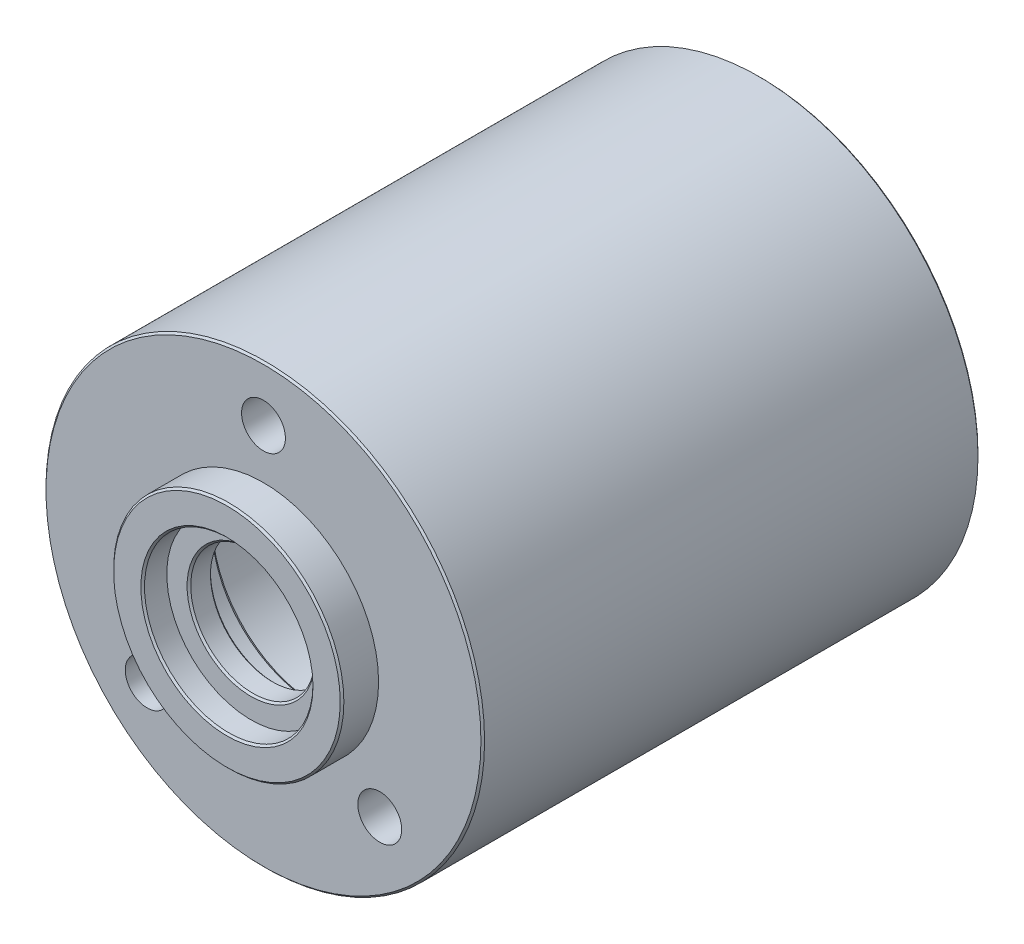
ISO-10303-21;
HEADER;
FILE_DESCRIPTION(('STEP AP214'),'2;1');
FILE_NAME('part.step','',(''),(''),'','','');
FILE_SCHEMA(('AUTOMOTIVE_DESIGN { 1 0 10303 214 1 1 1 1 }'));
ENDSEC;
DATA;
#1=APPLICATION_CONTEXT('core data for automotive mechanical design processes');
#2=APPLICATION_PROTOCOL_DEFINITION('international standard','automotive_design',2000,#1);
#3=PRODUCT_CONTEXT('',#1,'mechanical');
#4=PRODUCT('Part','Part','',(#3));
#5=PRODUCT_RELATED_PRODUCT_CATEGORY('part','',(#4));
#6=PRODUCT_DEFINITION_FORMATION('','',#4);
#7=PRODUCT_DEFINITION_CONTEXT('part definition',#1,'design');
#8=PRODUCT_DEFINITION('design','',#6,#7);
#9=PRODUCT_DEFINITION_SHAPE('','',#8);
#10=(LENGTH_UNIT() NAMED_UNIT(*) SI_UNIT(.MILLI.,.METRE.));
#11=(NAMED_UNIT(*) PLANE_ANGLE_UNIT() SI_UNIT($,.RADIAN.));
#12=(NAMED_UNIT(*) SI_UNIT($,.STERADIAN.) SOLID_ANGLE_UNIT());
#13=UNCERTAINTY_MEASURE_WITH_UNIT(LENGTH_MEASURE(1.E-05),#10,'distance_accuracy_value','');
#14=(GEOMETRIC_REPRESENTATION_CONTEXT(3) GLOBAL_UNCERTAINTY_ASSIGNED_CONTEXT((#13)) GLOBAL_UNIT_ASSIGNED_CONTEXT((#10,
#11,#12)) REPRESENTATION_CONTEXT('',''));
#15=CARTESIAN_POINT('',(0.,0.,0.));
#16=DIRECTION('',(0.,0.,1.));
#17=DIRECTION('',(1.,0.,0.));
#18=AXIS2_PLACEMENT_3D('',#15,#16,#17);
#19=CARTESIAN_POINT('',(0.,0.,0.));
#20=DIRECTION('',(0.,0.,1.));
#21=DIRECTION('',(1.,0.,0.));
#22=AXIS2_PLACEMENT_3D('',#19,#20,#21);
#23=CYLINDRICAL_SURFACE('',#22,26.85);
#24=CARTESIAN_POINT('',(0.,0.,-72.));
#25=DIRECTION('',(0.,0.,1.));
#26=DIRECTION('',(1.,0.,0.));
#27=AXIS2_PLACEMENT_3D('',#24,#25,#26);
#28=CIRCLE('',#27,26.85);
#29=CARTESIAN_POINT('',(26.85,0.,-72.));
#30=VERTEX_POINT('',#29);
#31=EDGE_CURVE('E114',#30,#30,#28,.T.);
#32=ORIENTED_EDGE('',*,*,#31,.F.);
#33=EDGE_LOOP('',(#32));
#34=FACE_BOUND('',#33,.T.);
#35=CARTESIAN_POINT('',(0.,0.,-73.));
#36=DIRECTION('',(0.,0.,1.));
#37=DIRECTION('',(1.,0.,0.));
#38=AXIS2_PLACEMENT_3D('',#35,#36,#37);
#39=CIRCLE('',#38,26.85);
#40=CARTESIAN_POINT('',(26.85,0.,-73.));
#41=VERTEX_POINT('',#40);
#42=EDGE_CURVE('E10',#41,#41,#39,.T.);
#43=ORIENTED_EDGE('',*,*,#42,.T.);
#44=EDGE_LOOP('',(#43));
#45=FACE_BOUND('',#44,.T.);
#46=ADVANCED_FACE('F41',(#34,#45),#23,.T.);
#47=CARTESIAN_POINT('',(0.,14.85,-73.));
#48=DIRECTION('',(0.,0.,1.));
#49=DIRECTION('',(1.,0.,0.));
#50=AXIS2_PLACEMENT_3D('',#47,#48,#49);
#51=PLANE('',#50);
#52=CARTESIAN_POINT('',(-11.6168075671897,15.9891639090726,-73.));
#53=DIRECTION('',(0.,0.,-1.));
#54=DIRECTION('',(-1.,0.,0.));
#55=AXIS2_PLACEMENT_3D('',#52,#53,#54);
#56=CIRCLE('',#55,3.25);
#57=CARTESIAN_POINT('',(-14.8668075671897,15.9891639090726,-73.));
#58=VERTEX_POINT('',#57);
#59=EDGE_CURVE('E139',#58,#58,#56,.T.);
#60=ORIENTED_EDGE('',*,*,#59,.F.);
#61=EDGE_LOOP('',(#60));
#62=FACE_BOUND('',#61,.T.);
#63=CARTESIAN_POINT('',(-20.1126963088461,6.9010222536304,-73.));
#64=DIRECTION('',(0.,0.,-1.));
#65=DIRECTION('',(-1.,0.,0.));
#66=AXIS2_PLACEMENT_3D('',#63,#64,#65);
#67=CIRCLE('',#66,3.69744332200011);
#68=CARTESIAN_POINT('',(-23.8101396308462,6.9010222536304,-73.));
#69=VERTEX_POINT('',#68);
#70=EDGE_CURVE('E182',#69,#69,#67,.T.);
#71=ORIENTED_EDGE('',*,*,#70,.F.);
#72=EDGE_LOOP('',(#71));
#73=FACE_BOUND('',#72,.T.);
#74=CARTESIAN_POINT('',(-18.7963894844799,-6.1073171615726,-73.));
#75=DIRECTION('',(0.,0.,-1.));
#76=DIRECTION('',(-1.,0.,0.));
#77=AXIS2_PLACEMENT_3D('',#74,#75,#76);
#78=CIRCLE('',#77,3.25);
#79=CARTESIAN_POINT('',(-22.0463894844799,-6.1073171615726,-73.));
#80=VERTEX_POINT('',#79);
#81=EDGE_CURVE('E176',#80,#80,#78,.T.);
#82=ORIENTED_EDGE('',*,*,#81,.F.);
#83=EDGE_LOOP('',(#82));
#84=FACE_BOUND('',#83,.T.);
#85=CARTESIAN_POINT('',(-12.4500000000001,-17.1499999999999,-73.));
#86=DIRECTION('',(0.,0.,-1.));
#87=DIRECTION('',(-1.,0.,0.));
#88=AXIS2_PLACEMENT_3D('',#85,#86,#87);
#89=CIRCLE('',#88,3.4);
#90=CARTESIAN_POINT('',(-15.8500000000001,-17.1499999999999,-73.));
#91=VERTEX_POINT('',#90);
#92=EDGE_CURVE('E170',#91,#91,#89,.T.);
#93=ORIENTED_EDGE('',*,*,#92,.F.);
#94=EDGE_LOOP('',(#93));
#95=FACE_BOUND('',#94,.T.);
#96=CARTESIAN_POINT('',(0.,-19.763693495,-73.));
#97=DIRECTION('',(0.,0.,-1.));
#98=DIRECTION('',(-1.,0.,0.));
#99=AXIS2_PLACEMENT_3D('',#96,#97,#98);
#100=CIRCLE('',#99,3.25);
#101=CARTESIAN_POINT('',(-3.25,-19.763693495,-73.));
#102=VERTEX_POINT('',#101);
#103=EDGE_CURVE('E164',#102,#102,#100,.T.);
#104=ORIENTED_EDGE('',*,*,#103,.F.);
#105=EDGE_LOOP('',(#104));
#106=FACE_BOUND('',#105,.T.);
#107=CARTESIAN_POINT('',(12.4499999999999,-17.1500000000001,-73.));
#108=DIRECTION('',(0.,0.,-1.));
#109=DIRECTION('',(-1.,0.,0.));
#110=AXIS2_PLACEMENT_3D('',#107,#108,#109);
#111=CIRCLE('',#110,3.4);
#112=CARTESIAN_POINT('',(9.04999999999989,-17.1500000000001,-73.));
#113=VERTEX_POINT('',#112);
#114=EDGE_CURVE('E158',#113,#113,#111,.T.);
#115=ORIENTED_EDGE('',*,*,#114,.F.);
#116=EDGE_LOOP('',(#115));
#117=FACE_BOUND('',#116,.T.);
#118=CARTESIAN_POINT('',(18.7963894844799,-6.1073171615726,-73.));
#119=DIRECTION('',(0.,0.,-1.));
#120=DIRECTION('',(-1.,0.,0.));
#121=AXIS2_PLACEMENT_3D('',#118,#119,#120);
#122=CIRCLE('',#121,3.25);
#123=CARTESIAN_POINT('',(15.5463894844799,-6.1073171615726,-73.));
#124=VERTEX_POINT('',#123);
#125=EDGE_CURVE('E152',#124,#124,#122,.T.);
#126=ORIENTED_EDGE('',*,*,#125,.F.);
#127=EDGE_LOOP('',(#126));
#128=FACE_BOUND('',#127,.T.);
#129=CARTESIAN_POINT('',(20.1126963088462,6.90102225363012,-73.));
#130=DIRECTION('',(0.,0.,-1.));
#131=DIRECTION('',(-1.,0.,0.));
#132=AXIS2_PLACEMENT_3D('',#129,#130,#131);
#133=CIRCLE('',#132,3.69744332200011);
#134=CARTESIAN_POINT('',(16.4152529868461,6.90102225363012,-73.));
#135=VERTEX_POINT('',#134);
#136=EDGE_CURVE('E145',#135,#135,#133,.T.);
#137=ORIENTED_EDGE('',*,*,#136,.F.);
#138=EDGE_LOOP('',(#137));
#139=FACE_BOUND('',#138,.T.);
#140=CARTESIAN_POINT('',(11.6168075671897,15.9891639090726,-73.));
#141=DIRECTION('',(0.,0.,-1.));
#142=DIRECTION('',(-1.,0.,0.));
#143=AXIS2_PLACEMENT_3D('',#140,#141,#142);
#144=CIRCLE('',#143,3.25);
#145=CARTESIAN_POINT('',(8.36680756718969,15.9891639090726,-73.));
#146=VERTEX_POINT('',#145);
#147=EDGE_CURVE('E146',#146,#146,#144,.T.);
#148=ORIENTED_EDGE('',*,*,#147,.F.);
#149=EDGE_LOOP('',(#148));
#150=FACE_BOUND('',#149,.T.);
#151=CARTESIAN_POINT('',(2.24538269921748E-13,21.2,-73.));
#152=DIRECTION('',(0.,0.,-1.));
#153=DIRECTION('',(-1.,0.,0.));
#154=AXIS2_PLACEMENT_3D('',#151,#152,#153);
#155=CIRCLE('',#154,3.4);
#156=CARTESIAN_POINT('',(-3.39999999999978,21.2,-73.));
#157=VERTEX_POINT('',#156);
#158=EDGE_CURVE('E136',#157,#157,#155,.T.);
#159=ORIENTED_EDGE('',*,*,#158,.F.);
#160=EDGE_LOOP('',(#159));
#161=FACE_BOUND('',#160,.T.);
#162=ORIENTED_EDGE('',*,*,#42,.F.);
#163=EDGE_LOOP('',(#162));
#164=FACE_BOUND('',#163,.T.);
#165=CARTESIAN_POINT('',(0.,0.,-73.));
#166=DIRECTION('',(0.,0.,1.));
#167=DIRECTION('',(1.,0.,0.));
#168=AXIS2_PLACEMENT_3D('',#165,#166,#167);
#169=CIRCLE('',#168,14.85);
#170=CARTESIAN_POINT('',(14.85,0.,-73.));
#171=VERTEX_POINT('',#170);
#172=EDGE_CURVE('E47',#171,#171,#169,.T.);
#173=ORIENTED_EDGE('',*,*,#172,.T.);
#174=EDGE_LOOP('',(#173));
#175=FACE_BOUND('',#174,.T.);
#176=ADVANCED_FACE('F198',(#62,#73,#84,#95,#106,#117,#128,#139,#150,#161,#164,#175),#51,.F.);
#177=CARTESIAN_POINT('',(0.,0.,-72.75));
#178=DIRECTION('',(0.,0.,-1.));
#179=DIRECTION('',(-1.,0.,0.));
#180=AXIS2_PLACEMENT_3D('',#177,#178,#179);
#181=CONICAL_SURFACE('',#180,14.6,0.785398163397448);
#182=ORIENTED_EDGE('',*,*,#172,.F.);
#183=EDGE_LOOP('',(#182));
#184=FACE_BOUND('',#183,.T.);
#185=CARTESIAN_POINT('',(0.,0.,-72.75));
#186=DIRECTION('',(0.,0.,1.));
#187=DIRECTION('',(1.,0.,0.));
#188=AXIS2_PLACEMENT_3D('',#185,#186,#187);
#189=CIRCLE('',#188,14.6);
#190=CARTESIAN_POINT('',(14.6,0.,-72.75));
#191=VERTEX_POINT('',#190);
#192=EDGE_CURVE('E51',#191,#191,#189,.T.);
#193=ORIENTED_EDGE('',*,*,#192,.T.);
#194=EDGE_LOOP('',(#193));
#195=FACE_BOUND('',#194,.T.);
#196=ADVANCED_FACE('F201',(#184,#195),#181,.F.);
#197=CARTESIAN_POINT('',(0.,0.,0.));
#198=DIRECTION('',(0.,0.,1.));
#199=DIRECTION('',(1.,0.,0.));
#200=AXIS2_PLACEMENT_3D('',#197,#198,#199);
#201=CYLINDRICAL_SURFACE('',#200,14.6);
#202=ORIENTED_EDGE('',*,*,#192,.F.);
#203=EDGE_LOOP('',(#202));
#204=FACE_BOUND('',#203,.T.);
#205=CARTESIAN_POINT('',(0.,0.,-12.575));
#206=DIRECTION('',(0.,0.,1.));
#207=DIRECTION('',(1.,0.,0.));
#208=AXIS2_PLACEMENT_3D('',#205,#206,#207);
#209=CIRCLE('',#208,14.6);
#210=CARTESIAN_POINT('',(14.6,0.,-12.575));
#211=VERTEX_POINT('',#210);
#212=EDGE_CURVE('E55',#211,#211,#209,.T.);
#213=ORIENTED_EDGE('',*,*,#212,.T.);
#214=EDGE_LOOP('',(#213));
#215=FACE_BOUND('',#214,.T.);
#216=ADVANCED_FACE('F315',(#204,#215),#201,.F.);
#217=CARTESIAN_POINT('',(0.,0.,-12.));
#218=DIRECTION('',(0.,0.,-1.));
#219=DIRECTION('',(-1.,0.,0.));
#220=AXIS2_PLACEMENT_3D('',#217,#218,#219);
#221=CONICAL_SURFACE('',#220,14.025,0.78539816339745);
#222=ORIENTED_EDGE('',*,*,#212,.F.);
#223=EDGE_LOOP('',(#222));
#224=FACE_BOUND('',#223,.T.);
#225=CARTESIAN_POINT('',(0.,0.,-12.));
#226=DIRECTION('',(0.,0.,1.));
#227=DIRECTION('',(1.,0.,0.));
#228=AXIS2_PLACEMENT_3D('',#225,#226,#227);
#229=CIRCLE('',#228,14.025);
#230=CARTESIAN_POINT('',(14.025,0.,-12.));
#231=VERTEX_POINT('',#230);
#232=EDGE_CURVE('E60',#231,#231,#229,.T.);
#233=ORIENTED_EDGE('',*,*,#232,.T.);
#234=EDGE_LOOP('',(#233));
#235=FACE_BOUND('',#234,.T.);
#236=ADVANCED_FACE('F311',(#224,#235),#221,.F.);
#237=CARTESIAN_POINT('',(0.,0.,0.));
#238=DIRECTION('',(0.,0.,1.));
#239=DIRECTION('',(1.,0.,0.));
#240=AXIS2_PLACEMENT_3D('',#237,#238,#239);
#241=CYLINDRICAL_SURFACE('',#240,14.025);
#242=ORIENTED_EDGE('',*,*,#232,.F.);
#243=EDGE_LOOP('',(#242));
#244=FACE_BOUND('',#243,.T.);
#245=CARTESIAN_POINT('',(0.,0.,-6.5));
#246=DIRECTION('',(0.,0.,1.));
#247=DIRECTION('',(1.,0.,0.));
#248=AXIS2_PLACEMENT_3D('',#245,#246,#247);
#249=CIRCLE('',#248,14.025);
#250=CARTESIAN_POINT('',(14.025,0.,-6.5));
#251=VERTEX_POINT('',#250);
#252=EDGE_CURVE('E63',#251,#251,#249,.T.);
#253=ORIENTED_EDGE('',*,*,#252,.T.);
#254=EDGE_LOOP('',(#253));
#255=FACE_BOUND('',#254,.T.);
#256=ADVANCED_FACE('F307',(#244,#255),#241,.F.);
#257=CARTESIAN_POINT('',(0.,8.75,-6.5));
#258=DIRECTION('',(0.,0.,1.));
#259=DIRECTION('',(1.,0.,0.));
#260=AXIS2_PLACEMENT_3D('',#257,#258,#259);
#261=PLANE('',#260);
#262=ORIENTED_EDGE('',*,*,#252,.F.);
#263=EDGE_LOOP('',(#262));
#264=FACE_BOUND('',#263,.T.);
#265=CARTESIAN_POINT('',(0.,0.,-6.5));
#266=DIRECTION('',(0.,0.,1.));
#267=DIRECTION('',(1.,0.,0.));
#268=AXIS2_PLACEMENT_3D('',#265,#266,#267);
#269=CIRCLE('',#268,8.75);
#270=CARTESIAN_POINT('',(8.75,0.,-6.5));
#271=VERTEX_POINT('',#270);
#272=EDGE_CURVE('E66',#271,#271,#269,.T.);
#273=ORIENTED_EDGE('',*,*,#272,.T.);
#274=EDGE_LOOP('',(#273));
#275=FACE_BOUND('',#274,.T.);
#276=ADVANCED_FACE('F303',(#264,#275),#261,.F.);
#277=CARTESIAN_POINT('',(0.,0.,-6.25));
#278=DIRECTION('',(0.,0.,-1.));
#279=DIRECTION('',(-1.,0.,0.));
#280=AXIS2_PLACEMENT_3D('',#277,#278,#279);
#281=CONICAL_SURFACE('',#280,8.5,0.785398163397448);
#282=ORIENTED_EDGE('',*,*,#272,.F.);
#283=EDGE_LOOP('',(#282));
#284=FACE_BOUND('',#283,.T.);
#285=CARTESIAN_POINT('',(0.,0.,-6.25));
#286=DIRECTION('',(0.,0.,1.));
#287=DIRECTION('',(1.,0.,0.));
#288=AXIS2_PLACEMENT_3D('',#285,#286,#287);
#289=CIRCLE('',#288,8.5);
#290=CARTESIAN_POINT('',(8.5,0.,-6.25));
#291=VERTEX_POINT('',#290);
#292=EDGE_CURVE('E69',#291,#291,#289,.T.);
#293=ORIENTED_EDGE('',*,*,#292,.T.);
#294=EDGE_LOOP('',(#293));
#295=FACE_BOUND('',#294,.T.);
#296=ADVANCED_FACE('F299',(#284,#295),#281,.F.);
#297=CARTESIAN_POINT('',(0.,0.,0.));
#298=DIRECTION('',(0.,0.,1.));
#299=DIRECTION('',(1.,0.,0.));
#300=AXIS2_PLACEMENT_3D('',#297,#298,#299);
#301=CYLINDRICAL_SURFACE('',#300,8.5);
#302=ORIENTED_EDGE('',*,*,#292,.F.);
#303=EDGE_LOOP('',(#302));
#304=FACE_BOUND('',#303,.T.);
#305=CARTESIAN_POINT('',(0.,0.,-3.55));
#306=DIRECTION('',(0.,0.,1.));
#307=DIRECTION('',(1.,0.,0.));
#308=AXIS2_PLACEMENT_3D('',#305,#306,#307);
#309=CIRCLE('',#308,8.5);
#310=CARTESIAN_POINT('',(8.5,0.,-3.55));
#311=VERTEX_POINT('',#310);
#312=EDGE_CURVE('E72',#311,#311,#309,.T.);
#313=ORIENTED_EDGE('',*,*,#312,.T.);
#314=EDGE_LOOP('',(#313));
#315=FACE_BOUND('',#314,.T.);
#316=ADVANCED_FACE('F295',(#304,#315),#301,.F.);
#317=CARTESIAN_POINT('',(0.,0.,-3.3));
#318=DIRECTION('',(0.,0.,1.));
#319=DIRECTION('',(1.,0.,0.));
#320=AXIS2_PLACEMENT_3D('',#317,#318,#319);
#321=CONICAL_SURFACE('',#320,8.75,0.785398163397447);
#322=ORIENTED_EDGE('',*,*,#312,.F.);
#323=EDGE_LOOP('',(#322));
#324=FACE_BOUND('',#323,.T.);
#325=CARTESIAN_POINT('',(0.,0.,-3.3));
#326=DIRECTION('',(0.,0.,1.));
#327=DIRECTION('',(1.,0.,0.));
#328=AXIS2_PLACEMENT_3D('',#325,#326,#327);
#329=CIRCLE('',#328,8.75);
#330=CARTESIAN_POINT('',(8.75,0.,-3.3));
#331=VERTEX_POINT('',#330);
#332=EDGE_CURVE('E75',#331,#331,#329,.T.);
#333=ORIENTED_EDGE('',*,*,#332,.T.);
#334=EDGE_LOOP('',(#333));
#335=FACE_BOUND('',#334,.T.);
#336=ADVANCED_FACE('F291',(#324,#335),#321,.F.);
#337=CARTESIAN_POINT('',(0.,11.525,-3.3));
#338=DIRECTION('',(0.,0.,-1.));
#339=DIRECTION('',(-1.,0.,0.));
#340=AXIS2_PLACEMENT_3D('',#337,#338,#339);
#341=PLANE('',#340);
#342=ORIENTED_EDGE('',*,*,#332,.F.);
#343=EDGE_LOOP('',(#342));
#344=FACE_BOUND('',#343,.T.);
#345=CARTESIAN_POINT('',(0.,0.,-3.3));
#346=DIRECTION('',(0.,0.,1.));
#347=DIRECTION('',(1.,0.,0.));
#348=AXIS2_PLACEMENT_3D('',#345,#346,#347);
#349=CIRCLE('',#348,11.525);
#350=CARTESIAN_POINT('',(11.525,0.,-3.3));
#351=VERTEX_POINT('',#350);
#352=EDGE_CURVE('E78',#351,#351,#349,.T.);
#353=ORIENTED_EDGE('',*,*,#352,.T.);
#354=EDGE_LOOP('',(#353));
#355=FACE_BOUND('',#354,.T.);
#356=ADVANCED_FACE('F287',(#344,#355),#341,.F.);
#357=CARTESIAN_POINT('',(0.,0.,0.));
#358=DIRECTION('',(0.,0.,1.));
#359=DIRECTION('',(1.,0.,0.));
#360=AXIS2_PLACEMENT_3D('',#357,#358,#359);
#361=CYLINDRICAL_SURFACE('',#360,11.525);
#362=ORIENTED_EDGE('',*,*,#352,.F.);
#363=EDGE_LOOP('',(#362));
#364=FACE_BOUND('',#363,.T.);
#365=CARTESIAN_POINT('',(0.,0.,-0.25));
#366=DIRECTION('',(0.,0.,1.));
#367=DIRECTION('',(1.,0.,0.));
#368=AXIS2_PLACEMENT_3D('',#365,#366,#367);
#369=CIRCLE('',#368,11.525);
#370=CARTESIAN_POINT('',(11.525,0.,-0.25));
#371=VERTEX_POINT('',#370);
#372=EDGE_CURVE('E81',#371,#371,#369,.T.);
#373=ORIENTED_EDGE('',*,*,#372,.T.);
#374=EDGE_LOOP('',(#373));
#375=FACE_BOUND('',#374,.T.);
#376=ADVANCED_FACE('F283',(#364,#375),#361,.F.);
#377=CARTESIAN_POINT('',(0.,0.,0.));
#378=DIRECTION('',(0.,0.,1.));
#379=DIRECTION('',(1.,0.,0.));
#380=AXIS2_PLACEMENT_3D('',#377,#378,#379);
#381=CONICAL_SURFACE('',#380,11.775,0.785398163397449);
#382=ORIENTED_EDGE('',*,*,#372,.F.);
#383=EDGE_LOOP('',(#382));
#384=FACE_BOUND('',#383,.T.);
#385=CARTESIAN_POINT('',(0.,0.,0.));
#386=DIRECTION('',(0.,0.,1.));
#387=DIRECTION('',(1.,0.,0.));
#388=AXIS2_PLACEMENT_3D('',#385,#386,#387);
#389=CIRCLE('',#388,11.775);
#390=CARTESIAN_POINT('',(11.775,0.,0.));
#391=VERTEX_POINT('',#390);
#392=EDGE_CURVE('E84',#391,#391,#389,.T.);
#393=ORIENTED_EDGE('',*,*,#392,.T.);
#394=EDGE_LOOP('',(#393));
#395=FACE_BOUND('',#394,.T.);
#396=ADVANCED_FACE('F279',(#384,#395),#381,.F.);
#397=CARTESIAN_POINT('',(0.,11.775,0.));
#398=DIRECTION('',(0.,0.,-1.));
#399=DIRECTION('',(-1.,0.,0.));
#400=AXIS2_PLACEMENT_3D('',#397,#398,#399);
#401=PLANE('',#400);
#402=ORIENTED_EDGE('',*,*,#392,.F.);
#403=EDGE_LOOP('',(#402));
#404=FACE_BOUND('',#403,.T.);
#405=CARTESIAN_POINT('',(0.,0.,0.));
#406=DIRECTION('',(0.,0.,1.));
#407=DIRECTION('',(1.,0.,0.));
#408=AXIS2_PLACEMENT_3D('',#405,#406,#407);
#409=CIRCLE('',#408,15.5);
#410=CARTESIAN_POINT('',(15.5,0.,0.));
#411=VERTEX_POINT('',#410);
#412=EDGE_CURVE('E87',#411,#411,#409,.T.);
#413=ORIENTED_EDGE('',*,*,#412,.T.);
#414=EDGE_LOOP('',(#413));
#415=FACE_BOUND('',#414,.T.);
#416=ADVANCED_FACE('F275',(#404,#415),#401,.F.);
#417=CARTESIAN_POINT('',(0.,0.,-0.25));
#418=DIRECTION('',(0.,0.,-1.));
#419=DIRECTION('',(-1.,0.,0.));
#420=AXIS2_PLACEMENT_3D('',#417,#418,#419);
#421=CONICAL_SURFACE('',#420,15.75,0.785398163397449);
#422=ORIENTED_EDGE('',*,*,#412,.F.);
#423=EDGE_LOOP('',(#422));
#424=FACE_BOUND('',#423,.T.);
#425=CARTESIAN_POINT('',(0.,0.,-0.25));
#426=DIRECTION('',(0.,0.,1.));
#427=DIRECTION('',(1.,0.,0.));
#428=AXIS2_PLACEMENT_3D('',#425,#426,#427);
#429=CIRCLE('',#428,15.75);
#430=CARTESIAN_POINT('',(15.75,0.,-0.25));
#431=VERTEX_POINT('',#430);
#432=EDGE_CURVE('E90',#431,#431,#429,.T.);
#433=ORIENTED_EDGE('',*,*,#432,.T.);
#434=EDGE_LOOP('',(#433));
#435=FACE_BOUND('',#434,.T.);
#436=ADVANCED_FACE('F271',(#424,#435),#421,.T.);
#437=CARTESIAN_POINT('',(0.,0.,0.));
#438=DIRECTION('',(0.,0.,1.));
#439=DIRECTION('',(1.,0.,0.));
#440=AXIS2_PLACEMENT_3D('',#437,#438,#439);
#441=CYLINDRICAL_SURFACE('',#440,15.75);
#442=ORIENTED_EDGE('',*,*,#432,.F.);
#443=EDGE_LOOP('',(#442));
#444=FACE_BOUND('',#443,.T.);
#445=CARTESIAN_POINT('',(0.,0.,-5.));
#446=DIRECTION('',(0.,0.,1.));
#447=DIRECTION('',(1.,0.,0.));
#448=AXIS2_PLACEMENT_3D('',#445,#446,#447);
#449=CIRCLE('',#448,15.75);
#450=CARTESIAN_POINT('',(15.75,0.,-5.));
#451=VERTEX_POINT('',#450);
#452=EDGE_CURVE('E93',#451,#451,#449,.T.);
#453=ORIENTED_EDGE('',*,*,#452,.T.);
#454=EDGE_LOOP('',(#453));
#455=FACE_BOUND('',#454,.T.);
#456=ADVANCED_FACE('F267',(#444,#455),#441,.T.);
#457=CARTESIAN_POINT('',(0.,15.75,-5.));
#458=DIRECTION('',(0.,0.,-1.));
#459=DIRECTION('',(-1.,0.,0.));
#460=AXIS2_PLACEMENT_3D('',#457,#458,#459);
#461=PLANE('',#460);
#462=CARTESIAN_POINT('',(0.,22.5,-5.));
#463=DIRECTION('',(0.,0.,1.));
#464=DIRECTION('',(1.,0.,0.));
#465=AXIS2_PLACEMENT_3D('',#462,#463,#464);
#466=CIRCLE('',#465,3.);
#467=CARTESIAN_POINT('',(3.,22.5,-5.));
#468=VERTEX_POINT('',#467);
#469=EDGE_CURVE('E131',#468,#468,#466,.T.);
#470=ORIENTED_EDGE('',*,*,#469,.F.);
#471=EDGE_LOOP('',(#470));
#472=FACE_BOUND('',#471,.T.);
#473=CARTESIAN_POINT('',(-15.9099025766974,-15.9099025766974,-5.));
#474=DIRECTION('',(0.,0.,1.));
#475=DIRECTION('',(1.,0.,0.));
#476=AXIS2_PLACEMENT_3D('',#473,#474,#475);
#477=CIRCLE('',#476,3.);
#478=CARTESIAN_POINT('',(-12.9099025766974,-15.9099025766974,-5.));
#479=VERTEX_POINT('',#478);
#480=EDGE_CURVE('E128',#479,#479,#477,.T.);
#481=ORIENTED_EDGE('',*,*,#480,.F.);
#482=EDGE_LOOP('',(#481));
#483=FACE_BOUND('',#482,.T.);
#484=CARTESIAN_POINT('',(15.9099025766974,-15.9099025766974,-5.));
#485=DIRECTION('',(0.,0.,1.));
#486=DIRECTION('',(1.,0.,0.));
#487=AXIS2_PLACEMENT_3D('',#484,#485,#486);
#488=CIRCLE('',#487,3.);
#489=CARTESIAN_POINT('',(18.9099025766974,-15.9099025766974,-5.));
#490=VERTEX_POINT('',#489);
#491=EDGE_CURVE('E121',#490,#490,#488,.T.);
#492=ORIENTED_EDGE('',*,*,#491,.F.);
#493=EDGE_LOOP('',(#492));
#494=FACE_BOUND('',#493,.T.);
#495=ORIENTED_EDGE('',*,*,#452,.F.);
#496=EDGE_LOOP('',(#495));
#497=FACE_BOUND('',#496,.T.);
#498=CARTESIAN_POINT('',(0.,0.,-5.));
#499=DIRECTION('',(0.,0.,1.));
#500=DIRECTION('',(1.,0.,0.));
#501=AXIS2_PLACEMENT_3D('',#498,#499,#500);
#502=CIRCLE('',#501,29.75);
#503=CARTESIAN_POINT('',(29.75,0.,-5.));
#504=VERTEX_POINT('',#503);
#505=EDGE_CURVE('E96',#504,#504,#502,.T.);
#506=ORIENTED_EDGE('',*,*,#505,.T.);
#507=EDGE_LOOP('',(#506));
#508=FACE_BOUND('',#507,.T.);
#509=ADVANCED_FACE('F264',(#472,#483,#494,#497,#508),#461,.F.);
#510=CARTESIAN_POINT('',(0.,0.,-5.25));
#511=DIRECTION('',(0.,0.,-1.));
#512=DIRECTION('',(-1.,0.,0.));
#513=AXIS2_PLACEMENT_3D('',#510,#511,#512);
#514=CONICAL_SURFACE('',#513,30.,0.785398163397448);
#515=ORIENTED_EDGE('',*,*,#505,.F.);
#516=EDGE_LOOP('',(#515));
#517=FACE_BOUND('',#516,.T.);
#518=CARTESIAN_POINT('',(0.,0.,-5.25));
#519=DIRECTION('',(0.,0.,1.));
#520=DIRECTION('',(1.,0.,0.));
#521=AXIS2_PLACEMENT_3D('',#518,#519,#520);
#522=CIRCLE('',#521,30.);
#523=CARTESIAN_POINT('',(30.,0.,-5.25));
#524=VERTEX_POINT('',#523);
#525=EDGE_CURVE('E99',#524,#524,#522,.T.);
#526=ORIENTED_EDGE('',*,*,#525,.T.);
#527=EDGE_LOOP('',(#526));
#528=FACE_BOUND('',#527,.T.);
#529=ADVANCED_FACE('F260',(#517,#528),#514,.T.);
#530=CARTESIAN_POINT('',(0.,0.,0.));
#531=DIRECTION('',(0.,0.,1.));
#532=DIRECTION('',(1.,0.,0.));
#533=AXIS2_PLACEMENT_3D('',#530,#531,#532);
#534=CYLINDRICAL_SURFACE('',#533,30.);
#535=ORIENTED_EDGE('',*,*,#525,.F.);
#536=EDGE_LOOP('',(#535));
#537=FACE_BOUND('',#536,.T.);
#538=CARTESIAN_POINT('',(0.,0.,-72.75));
#539=DIRECTION('',(0.,0.,1.));
#540=DIRECTION('',(1.,0.,0.));
#541=AXIS2_PLACEMENT_3D('',#538,#539,#540);
#542=CIRCLE('',#541,30.);
#543=CARTESIAN_POINT('',(30.,0.,-72.75));
#544=VERTEX_POINT('',#543);
#545=EDGE_CURVE('E102',#544,#544,#542,.T.);
#546=ORIENTED_EDGE('',*,*,#545,.T.);
#547=EDGE_LOOP('',(#546));
#548=FACE_BOUND('',#547,.T.);
#549=ADVANCED_FACE('F256',(#537,#548),#534,.T.);
#550=CARTESIAN_POINT('',(0.,0.,-73.));
#551=DIRECTION('',(0.,0.,1.));
#552=DIRECTION('',(1.,0.,0.));
#553=AXIS2_PLACEMENT_3D('',#550,#551,#552);
#554=CONICAL_SURFACE('',#553,29.75,0.785398163397448);
#555=ORIENTED_EDGE('',*,*,#545,.F.);
#556=EDGE_LOOP('',(#555));
#557=FACE_BOUND('',#556,.T.);
#558=CARTESIAN_POINT('',(0.,0.,-73.));
#559=DIRECTION('',(0.,0.,1.));
#560=DIRECTION('',(1.,0.,0.));
#561=AXIS2_PLACEMENT_3D('',#558,#559,#560);
#562=CIRCLE('',#561,29.75);
#563=CARTESIAN_POINT('',(29.75,0.,-73.));
#564=VERTEX_POINT('',#563);
#565=EDGE_CURVE('E105',#564,#564,#562,.T.);
#566=ORIENTED_EDGE('',*,*,#565,.T.);
#567=EDGE_LOOP('',(#566));
#568=FACE_BOUND('',#567,.T.);
#569=ADVANCED_FACE('F252',(#557,#568),#554,.T.);
#570=CARTESIAN_POINT('',(0.,28.85,-73.));
#571=DIRECTION('',(0.,0.,1.));
#572=DIRECTION('',(1.,0.,0.));
#573=AXIS2_PLACEMENT_3D('',#570,#571,#572);
#574=PLANE('',#573);
#575=ORIENTED_EDGE('',*,*,#565,.F.);
#576=EDGE_LOOP('',(#575));
#577=FACE_BOUND('',#576,.T.);
#578=CARTESIAN_POINT('',(0.,0.,-73.));
#579=DIRECTION('',(0.,0.,1.));
#580=DIRECTION('',(1.,0.,0.));
#581=AXIS2_PLACEMENT_3D('',#578,#579,#580);
#582=CIRCLE('',#581,28.85);
#583=CARTESIAN_POINT('',(28.85,0.,-73.));
#584=VERTEX_POINT('',#583);
#585=EDGE_CURVE('E108',#584,#584,#582,.T.);
#586=ORIENTED_EDGE('',*,*,#585,.T.);
#587=EDGE_LOOP('',(#586));
#588=FACE_BOUND('',#587,.T.);
#589=ADVANCED_FACE('F244',(#577,#588),#574,.F.);
#590=CARTESIAN_POINT('',(0.,0.,0.));
#591=DIRECTION('',(0.,0.,1.));
#592=DIRECTION('',(1.,0.,0.));
#593=AXIS2_PLACEMENT_3D('',#590,#591,#592);
#594=CYLINDRICAL_SURFACE('',#593,28.85);
#595=ORIENTED_EDGE('',*,*,#585,.F.);
#596=EDGE_LOOP('',(#595));
#597=FACE_BOUND('',#596,.T.);
#598=CARTESIAN_POINT('',(0.,0.,-72.));
#599=DIRECTION('',(0.,0.,1.));
#600=DIRECTION('',(1.,0.,0.));
#601=AXIS2_PLACEMENT_3D('',#598,#599,#600);
#602=CIRCLE('',#601,28.85);
#603=CARTESIAN_POINT('',(28.85,0.,-72.));
#604=VERTEX_POINT('',#603);
#605=EDGE_CURVE('E111',#604,#604,#602,.T.);
#606=ORIENTED_EDGE('',*,*,#605,.T.);
#607=EDGE_LOOP('',(#606));
#608=FACE_BOUND('',#607,.T.);
#609=ADVANCED_FACE('F233',(#597,#608),#594,.F.);
#610=CARTESIAN_POINT('',(0.,26.85,-72.));
#611=DIRECTION('',(0.,0.,1.));
#612=DIRECTION('',(1.,0.,0.));
#613=AXIS2_PLACEMENT_3D('',#610,#611,#612);
#614=PLANE('',#613);
#615=ORIENTED_EDGE('',*,*,#605,.F.);
#616=EDGE_LOOP('',(#615));
#617=FACE_BOUND('',#616,.T.);
#618=ORIENTED_EDGE('',*,*,#31,.T.);
#619=EDGE_LOOP('',(#618));
#620=FACE_BOUND('',#619,.T.);
#621=ADVANCED_FACE('F230',(#617,#620),#614,.F.);
#622=CARTESIAN_POINT('',(15.9099025766974,-15.9099025766974,-28.));
#623=DIRECTION('',(0.,0.,1.));
#624=DIRECTION('',(1.,0.,0.));
#625=AXIS2_PLACEMENT_3D('',#622,#623,#624);
#626=CYLINDRICAL_SURFACE('',#625,3.);
#627=CARTESIAN_POINT('',(15.9099025766974,-15.9099025766974,-28.));
#628=DIRECTION('',(0.,0.,1.));
#629=DIRECTION('',(1.,0.,0.));
#630=AXIS2_PLACEMENT_3D('',#627,#628,#629);
#631=CIRCLE('',#630,3.);
#632=CARTESIAN_POINT('',(18.9099025766974,-15.9099025766974,-28.));
#633=VERTEX_POINT('',#632);
#634=EDGE_CURVE('E118',#633,#633,#631,.T.);
#635=ORIENTED_EDGE('',*,*,#634,.F.);
#636=EDGE_LOOP('',(#635));
#637=FACE_BOUND('',#636,.T.);
#638=ORIENTED_EDGE('',*,*,#491,.T.);
#639=EDGE_LOOP('',(#638));
#640=FACE_BOUND('',#639,.T.);
#641=ADVANCED_FACE('F232',(#637,#640),#626,.F.);
#642=CARTESIAN_POINT('',(15.9099025766974,-15.9099025766974,-28.));
#643=DIRECTION('',(0.,0.,1.));
#644=DIRECTION('',(1.,0.,0.));
#645=AXIS2_PLACEMENT_3D('',#642,#643,#644);
#646=PLANE('',#645);
#647=ORIENTED_EDGE('',*,*,#634,.T.);
#648=EDGE_LOOP('',(#647));
#649=FACE_BOUND('',#648,.T.);
#650=ADVANCED_FACE('F241',(#649),#646,.T.);
#651=CARTESIAN_POINT('',(-15.9099025766974,-15.9099025766974,-28.));
#652=DIRECTION('',(0.,0.,1.));
#653=DIRECTION('',(1.,0.,0.));
#654=AXIS2_PLACEMENT_3D('',#651,#652,#653);
#655=CYLINDRICAL_SURFACE('',#654,3.);
#656=CARTESIAN_POINT('',(-15.9099025766974,-15.9099025766974,-28.));
#657=DIRECTION('',(0.,0.,1.));
#658=DIRECTION('',(1.,0.,0.));
#659=AXIS2_PLACEMENT_3D('',#656,#657,#658);
#660=CIRCLE('',#659,3.);
#661=CARTESIAN_POINT('',(-12.9099025766974,-15.9099025766974,-28.));
#662=VERTEX_POINT('',#661);
#663=EDGE_CURVE('E125',#662,#662,#660,.T.);
#664=ORIENTED_EDGE('',*,*,#663,.F.);
#665=EDGE_LOOP('',(#664));
#666=FACE_BOUND('',#665,.T.);
#667=ORIENTED_EDGE('',*,*,#480,.T.);
#668=EDGE_LOOP('',(#667));
#669=FACE_BOUND('',#668,.T.);
#670=ADVANCED_FACE('F476',(#666,#669),#655,.F.);
#671=CARTESIAN_POINT('',(-15.9099025766974,-15.9099025766974,-28.));
#672=DIRECTION('',(0.,0.,1.));
#673=DIRECTION('',(1.,0.,0.));
#674=AXIS2_PLACEMENT_3D('',#671,#672,#673);
#675=PLANE('',#674);
#676=ORIENTED_EDGE('',*,*,#663,.T.);
#677=EDGE_LOOP('',(#676));
#678=FACE_BOUND('',#677,.T.);
#679=ADVANCED_FACE('F486',(#678),#675,.T.);
#680=CARTESIAN_POINT('',(0.,22.5,-28.));
#681=DIRECTION('',(0.,0.,1.));
#682=DIRECTION('',(1.,0.,0.));
#683=AXIS2_PLACEMENT_3D('',#680,#681,#682);
#684=CYLINDRICAL_SURFACE('',#683,3.);
#685=CARTESIAN_POINT('',(0.,22.5,-28.));
#686=DIRECTION('',(0.,0.,1.));
#687=DIRECTION('',(1.,0.,0.));
#688=AXIS2_PLACEMENT_3D('',#685,#686,#687);
#689=CIRCLE('',#688,3.);
#690=CARTESIAN_POINT('',(3.,22.5,-28.));
#691=VERTEX_POINT('',#690);
#692=EDGE_CURVE('E117',#691,#691,#689,.T.);
#693=ORIENTED_EDGE('',*,*,#692,.F.);
#694=EDGE_LOOP('',(#693));
#695=FACE_BOUND('',#694,.T.);
#696=ORIENTED_EDGE('',*,*,#469,.T.);
#697=EDGE_LOOP('',(#696));
#698=FACE_BOUND('',#697,.T.);
#699=ADVANCED_FACE('F219',(#695,#698),#684,.F.);
#700=CARTESIAN_POINT('',(0.,22.5,-28.));
#701=DIRECTION('',(0.,0.,1.));
#702=DIRECTION('',(1.,0.,0.));
#703=AXIS2_PLACEMENT_3D('',#700,#701,#702);
#704=PLANE('',#703);
#705=ORIENTED_EDGE('',*,*,#692,.T.);
#706=EDGE_LOOP('',(#705));
#707=FACE_BOUND('',#706,.T.);
#708=ADVANCED_FACE('F209',(#707),#704,.T.);
#709=CARTESIAN_POINT('',(2.24538269921748E-13,21.2,-50.));
#710=DIRECTION('',(0.,0.,-1.));
#711=DIRECTION('',(-1.,0.,0.));
#712=AXIS2_PLACEMENT_3D('',#709,#710,#711);
#713=CYLINDRICAL_SURFACE('',#712,3.4);
#714=CARTESIAN_POINT('',(2.24538269921748E-13,21.2,-50.));
#715=DIRECTION('',(0.,0.,-1.));
#716=DIRECTION('',(-1.,0.,0.));
#717=AXIS2_PLACEMENT_3D('',#714,#715,#716);
#718=CIRCLE('',#717,3.4);
#719=CARTESIAN_POINT('',(-3.39999999999978,21.2,-50.));
#720=VERTEX_POINT('',#719);
#721=EDGE_CURVE('E122',#720,#720,#718,.T.);
#722=ORIENTED_EDGE('',*,*,#721,.F.);
#723=EDGE_LOOP('',(#722));
#724=FACE_BOUND('',#723,.T.);
#725=ORIENTED_EDGE('',*,*,#158,.T.);
#726=EDGE_LOOP('',(#725));
#727=FACE_BOUND('',#726,.T.);
#728=ADVANCED_FACE('F206',(#724,#727),#713,.F.);
#729=CARTESIAN_POINT('',(2.24538269921748E-13,21.2,-50.));
#730=DIRECTION('',(0.,0.,-1.));
#731=DIRECTION('',(-1.,0.,0.));
#732=AXIS2_PLACEMENT_3D('',#729,#730,#731);
#733=PLANE('',#732);
#734=ORIENTED_EDGE('',*,*,#721,.T.);
#735=EDGE_LOOP('',(#734));
#736=FACE_BOUND('',#735,.T.);
#737=ADVANCED_FACE('F208',(#736),#733,.T.);
#738=CARTESIAN_POINT('',(11.6168075671897,15.9891639090726,-50.));
#739=DIRECTION('',(0.,0.,-1.));
#740=DIRECTION('',(-1.,0.,0.));
#741=AXIS2_PLACEMENT_3D('',#738,#739,#740);
#742=CYLINDRICAL_SURFACE('',#741,3.25);
#743=CARTESIAN_POINT('',(11.6168075671897,15.9891639090726,-50.));
#744=DIRECTION('',(0.,0.,-1.));
#745=DIRECTION('',(-1.,0.,0.));
#746=AXIS2_PLACEMENT_3D('',#743,#744,#745);
#747=CIRCLE('',#746,3.25);
#748=CARTESIAN_POINT('',(8.36680756718969,15.9891639090726,-50.));
#749=VERTEX_POINT('',#748);
#750=EDGE_CURVE('E190',#749,#749,#747,.T.);
#751=ORIENTED_EDGE('',*,*,#750,.F.);
#752=EDGE_LOOP('',(#751));
#753=FACE_BOUND('',#752,.T.);
#754=ORIENTED_EDGE('',*,*,#147,.T.);
#755=EDGE_LOOP('',(#754));
#756=FACE_BOUND('',#755,.T.);
#757=ADVANCED_FACE('F196',(#753,#756),#742,.F.);
#758=CARTESIAN_POINT('',(11.6168075671897,15.9891639090726,-50.));
#759=DIRECTION('',(0.,0.,-1.));
#760=DIRECTION('',(-1.,0.,0.));
#761=AXIS2_PLACEMENT_3D('',#758,#759,#760);
#762=PLANE('',#761);
#763=ORIENTED_EDGE('',*,*,#750,.T.);
#764=EDGE_LOOP('',(#763));
#765=FACE_BOUND('',#764,.T.);
#766=ADVANCED_FACE('F533',(#765),#762,.T.);
#767=CARTESIAN_POINT('',(20.1126963088462,6.90102225363012,-50.));
#768=DIRECTION('',(0.,0.,-1.));
#769=DIRECTION('',(-1.,0.,0.));
#770=AXIS2_PLACEMENT_3D('',#767,#768,#769);
#771=CYLINDRICAL_SURFACE('',#770,3.69744332200011);
#772=CARTESIAN_POINT('',(20.1126963088462,6.90102225363012,-50.));
#773=DIRECTION('',(0.,0.,-1.));
#774=DIRECTION('',(-1.,0.,0.));
#775=AXIS2_PLACEMENT_3D('',#772,#773,#774);
#776=CIRCLE('',#775,3.69744332200011);
#777=CARTESIAN_POINT('',(16.4152529868461,6.90102225363012,-50.));
#778=VERTEX_POINT('',#777);
#779=EDGE_CURVE('E142',#778,#778,#776,.T.);
#780=ORIENTED_EDGE('',*,*,#779,.F.);
#781=EDGE_LOOP('',(#780));
#782=FACE_BOUND('',#781,.T.);
#783=ORIENTED_EDGE('',*,*,#136,.T.);
#784=EDGE_LOOP('',(#783));
#785=FACE_BOUND('',#784,.T.);
#786=ADVANCED_FACE('F543',(#782,#785),#771,.F.);
#787=CARTESIAN_POINT('',(20.1126963088462,6.90102225363012,-50.));
#788=DIRECTION('',(0.,0.,-1.));
#789=DIRECTION('',(-1.,0.,0.));
#790=AXIS2_PLACEMENT_3D('',#787,#788,#789);
#791=PLANE('',#790);
#792=ORIENTED_EDGE('',*,*,#779,.T.);
#793=EDGE_LOOP('',(#792));
#794=FACE_BOUND('',#793,.T.);
#795=ADVANCED_FACE('F553',(#794),#791,.T.);
#796=CARTESIAN_POINT('',(18.7963894844799,-6.1073171615726,-50.));
#797=DIRECTION('',(0.,0.,-1.));
#798=DIRECTION('',(-1.,0.,0.));
#799=AXIS2_PLACEMENT_3D('',#796,#797,#798);
#800=CYLINDRICAL_SURFACE('',#799,3.25);
#801=CARTESIAN_POINT('',(18.7963894844799,-6.1073171615726,-50.));
#802=DIRECTION('',(0.,0.,-1.));
#803=DIRECTION('',(-1.,0.,0.));
#804=AXIS2_PLACEMENT_3D('',#801,#802,#803);
#805=CIRCLE('',#804,3.25);
#806=CARTESIAN_POINT('',(15.5463894844799,-6.1073171615726,-50.));
#807=VERTEX_POINT('',#806);
#808=EDGE_CURVE('E149',#807,#807,#805,.T.);
#809=ORIENTED_EDGE('',*,*,#808,.F.);
#810=EDGE_LOOP('',(#809));
#811=FACE_BOUND('',#810,.T.);
#812=ORIENTED_EDGE('',*,*,#125,.T.);
#813=EDGE_LOOP('',(#812));
#814=FACE_BOUND('',#813,.T.);
#815=ADVANCED_FACE('F563',(#811,#814),#800,.F.);
#816=CARTESIAN_POINT('',(18.7963894844799,-6.1073171615726,-50.));
#817=DIRECTION('',(0.,0.,-1.));
#818=DIRECTION('',(-1.,0.,0.));
#819=AXIS2_PLACEMENT_3D('',#816,#817,#818);
#820=PLANE('',#819);
#821=ORIENTED_EDGE('',*,*,#808,.T.);
#822=EDGE_LOOP('',(#821));
#823=FACE_BOUND('',#822,.T.);
#824=ADVANCED_FACE('F573',(#823),#820,.T.);
#825=CARTESIAN_POINT('',(12.4499999999999,-17.1500000000001,-50.));
#826=DIRECTION('',(0.,0.,-1.));
#827=DIRECTION('',(-1.,0.,0.));
#828=AXIS2_PLACEMENT_3D('',#825,#826,#827);
#829=CYLINDRICAL_SURFACE('',#828,3.4);
#830=CARTESIAN_POINT('',(12.4499999999999,-17.1500000000001,-50.));
#831=DIRECTION('',(0.,0.,-1.));
#832=DIRECTION('',(-1.,0.,0.));
#833=AXIS2_PLACEMENT_3D('',#830,#831,#832);
#834=CIRCLE('',#833,3.4);
#835=CARTESIAN_POINT('',(9.04999999999989,-17.1500000000001,-50.));
#836=VERTEX_POINT('',#835);
#837=EDGE_CURVE('E155',#836,#836,#834,.T.);
#838=ORIENTED_EDGE('',*,*,#837,.F.);
#839=EDGE_LOOP('',(#838));
#840=FACE_BOUND('',#839,.T.);
#841=ORIENTED_EDGE('',*,*,#114,.T.);
#842=EDGE_LOOP('',(#841));
#843=FACE_BOUND('',#842,.T.);
#844=ADVANCED_FACE('F583',(#840,#843),#829,.F.);
#845=CARTESIAN_POINT('',(12.4499999999999,-17.1500000000001,-50.));
#846=DIRECTION('',(0.,0.,-1.));
#847=DIRECTION('',(-1.,0.,0.));
#848=AXIS2_PLACEMENT_3D('',#845,#846,#847);
#849=PLANE('',#848);
#850=ORIENTED_EDGE('',*,*,#837,.T.);
#851=EDGE_LOOP('',(#850));
#852=FACE_BOUND('',#851,.T.);
#853=ADVANCED_FACE('F593',(#852),#849,.T.);
#854=CARTESIAN_POINT('',(0.,-19.763693495,-50.));
#855=DIRECTION('',(0.,0.,-1.));
#856=DIRECTION('',(-1.,0.,0.));
#857=AXIS2_PLACEMENT_3D('',#854,#855,#856);
#858=CYLINDRICAL_SURFACE('',#857,3.25);
#859=CARTESIAN_POINT('',(0.,-19.763693495,-50.));
#860=DIRECTION('',(0.,0.,-1.));
#861=DIRECTION('',(-1.,0.,0.));
#862=AXIS2_PLACEMENT_3D('',#859,#860,#861);
#863=CIRCLE('',#862,3.25);
#864=CARTESIAN_POINT('',(-3.25,-19.763693495,-50.));
#865=VERTEX_POINT('',#864);
#866=EDGE_CURVE('E161',#865,#865,#863,.T.);
#867=ORIENTED_EDGE('',*,*,#866,.F.);
#868=EDGE_LOOP('',(#867));
#869=FACE_BOUND('',#868,.T.);
#870=ORIENTED_EDGE('',*,*,#103,.T.);
#871=EDGE_LOOP('',(#870));
#872=FACE_BOUND('',#871,.T.);
#873=ADVANCED_FACE('F603',(#869,#872),#858,.F.);
#874=CARTESIAN_POINT('',(0.,-19.763693495,-50.));
#875=DIRECTION('',(0.,0.,-1.));
#876=DIRECTION('',(-1.,0.,0.));
#877=AXIS2_PLACEMENT_3D('',#874,#875,#876);
#878=PLANE('',#877);
#879=ORIENTED_EDGE('',*,*,#866,.T.);
#880=EDGE_LOOP('',(#879));
#881=FACE_BOUND('',#880,.T.);
#882=ADVANCED_FACE('F613',(#881),#878,.T.);
#883=CARTESIAN_POINT('',(-12.4500000000001,-17.1499999999999,-50.));
#884=DIRECTION('',(0.,0.,-1.));
#885=DIRECTION('',(-1.,0.,0.));
#886=AXIS2_PLACEMENT_3D('',#883,#884,#885);
#887=CYLINDRICAL_SURFACE('',#886,3.4);
#888=CARTESIAN_POINT('',(-12.4500000000001,-17.1499999999999,-50.));
#889=DIRECTION('',(0.,0.,-1.));
#890=DIRECTION('',(-1.,0.,0.));
#891=AXIS2_PLACEMENT_3D('',#888,#889,#890);
#892=CIRCLE('',#891,3.4);
#893=CARTESIAN_POINT('',(-15.8500000000001,-17.1499999999999,-50.));
#894=VERTEX_POINT('',#893);
#895=EDGE_CURVE('E167',#894,#894,#892,.T.);
#896=ORIENTED_EDGE('',*,*,#895,.F.);
#897=EDGE_LOOP('',(#896));
#898=FACE_BOUND('',#897,.T.);
#899=ORIENTED_EDGE('',*,*,#92,.T.);
#900=EDGE_LOOP('',(#899));
#901=FACE_BOUND('',#900,.T.);
#902=ADVANCED_FACE('F623',(#898,#901),#887,.F.);
#903=CARTESIAN_POINT('',(-12.4500000000001,-17.1499999999999,-50.));
#904=DIRECTION('',(0.,0.,-1.));
#905=DIRECTION('',(-1.,0.,0.));
#906=AXIS2_PLACEMENT_3D('',#903,#904,#905);
#907=PLANE('',#906);
#908=ORIENTED_EDGE('',*,*,#895,.T.);
#909=EDGE_LOOP('',(#908));
#910=FACE_BOUND('',#909,.T.);
#911=ADVANCED_FACE('F634',(#910),#907,.T.);
#912=CARTESIAN_POINT('',(-18.7963894844799,-6.1073171615726,-50.));
#913=DIRECTION('',(0.,0.,-1.));
#914=DIRECTION('',(-1.,0.,0.));
#915=AXIS2_PLACEMENT_3D('',#912,#913,#914);
#916=CYLINDRICAL_SURFACE('',#915,3.25);
#917=CARTESIAN_POINT('',(-18.7963894844799,-6.1073171615726,-50.));
#918=DIRECTION('',(0.,0.,-1.));
#919=DIRECTION('',(-1.,0.,0.));
#920=AXIS2_PLACEMENT_3D('',#917,#918,#919);
#921=CIRCLE('',#920,3.25);
#922=CARTESIAN_POINT('',(-22.0463894844799,-6.1073171615726,-50.));
#923=VERTEX_POINT('',#922);
#924=EDGE_CURVE('E173',#923,#923,#921,.T.);
#925=ORIENTED_EDGE('',*,*,#924,.F.);
#926=EDGE_LOOP('',(#925));
#927=FACE_BOUND('',#926,.T.);
#928=ORIENTED_EDGE('',*,*,#81,.T.);
#929=EDGE_LOOP('',(#928));
#930=FACE_BOUND('',#929,.T.);
#931=ADVANCED_FACE('F644',(#927,#930),#916,.F.);
#932=CARTESIAN_POINT('',(-18.7963894844799,-6.1073171615726,-50.));
#933=DIRECTION('',(0.,0.,-1.));
#934=DIRECTION('',(-1.,0.,0.));
#935=AXIS2_PLACEMENT_3D('',#932,#933,#934);
#936=PLANE('',#935);
#937=ORIENTED_EDGE('',*,*,#924,.T.);
#938=EDGE_LOOP('',(#937));
#939=FACE_BOUND('',#938,.T.);
#940=ADVANCED_FACE('F654',(#939),#936,.T.);
#941=CARTESIAN_POINT('',(-20.1126963088461,6.9010222536304,-50.));
#942=DIRECTION('',(0.,0.,-1.));
#943=DIRECTION('',(-1.,0.,0.));
#944=AXIS2_PLACEMENT_3D('',#941,#942,#943);
#945=CYLINDRICAL_SURFACE('',#944,3.69744332200011);
#946=CARTESIAN_POINT('',(-20.1126963088461,6.9010222536304,-50.));
#947=DIRECTION('',(0.,0.,-1.));
#948=DIRECTION('',(-1.,0.,0.));
#949=AXIS2_PLACEMENT_3D('',#946,#947,#948);
#950=CIRCLE('',#949,3.69744332200011);
#951=CARTESIAN_POINT('',(-23.8101396308462,6.9010222536304,-50.));
#952=VERTEX_POINT('',#951);
#953=EDGE_CURVE('E179',#952,#952,#950,.T.);
#954=ORIENTED_EDGE('',*,*,#953,.F.);
#955=EDGE_LOOP('',(#954));
#956=FACE_BOUND('',#955,.T.);
#957=ORIENTED_EDGE('',*,*,#70,.T.);
#958=EDGE_LOOP('',(#957));
#959=FACE_BOUND('',#958,.T.);
#960=ADVANCED_FACE('F664',(#956,#959),#945,.F.);
#961=CARTESIAN_POINT('',(-20.1126963088461,6.9010222536304,-50.));
#962=DIRECTION('',(0.,0.,-1.));
#963=DIRECTION('',(-1.,0.,0.));
#964=AXIS2_PLACEMENT_3D('',#961,#962,#963);
#965=PLANE('',#964);
#966=ORIENTED_EDGE('',*,*,#953,.T.);
#967=EDGE_LOOP('',(#966));
#968=FACE_BOUND('',#967,.T.);
#969=ADVANCED_FACE('F674',(#968),#965,.T.);
#970=CARTESIAN_POINT('',(-11.6168075671897,15.9891639090726,-50.));
#971=DIRECTION('',(0.,0.,-1.));
#972=DIRECTION('',(-1.,0.,0.));
#973=AXIS2_PLACEMENT_3D('',#970,#971,#972);
#974=CYLINDRICAL_SURFACE('',#973,3.25);
#975=CARTESIAN_POINT('',(-11.6168075671897,15.9891639090726,-50.));
#976=DIRECTION('',(0.,0.,-1.));
#977=DIRECTION('',(-1.,0.,0.));
#978=AXIS2_PLACEMENT_3D('',#975,#976,#977);
#979=CIRCLE('',#978,3.25);
#980=CARTESIAN_POINT('',(-14.8668075671897,15.9891639090726,-50.));
#981=VERTEX_POINT('',#980);
#982=EDGE_CURVE('E185',#981,#981,#979,.T.);
#983=ORIENTED_EDGE('',*,*,#982,.F.);
#984=EDGE_LOOP('',(#983));
#985=FACE_BOUND('',#984,.T.);
#986=ORIENTED_EDGE('',*,*,#59,.T.);
#987=EDGE_LOOP('',(#986));
#988=FACE_BOUND('',#987,.T.);
#989=ADVANCED_FACE('F684',(#985,#988),#974,.F.);
#990=CARTESIAN_POINT('',(-11.6168075671897,15.9891639090726,-50.));
#991=DIRECTION('',(0.,0.,-1.));
#992=DIRECTION('',(-1.,0.,0.));
#993=AXIS2_PLACEMENT_3D('',#990,#991,#992);
#994=PLANE('',#993);
#995=ORIENTED_EDGE('',*,*,#982,.T.);
#996=EDGE_LOOP('',(#995));
#997=FACE_BOUND('',#996,.T.);
#998=ADVANCED_FACE('F694',(#997),#994,.T.);
#999=CLOSED_SHELL('',(#46,#176,#196,#216,#236,#256,#276,#296,#316,#336,#356,#376,#396,#416,#436,
#456,#509,#529,#549,#569,#589,#609,#621,#641,#650,#670,#679,#699,#708,#728,#737,#757,#766,#786,
#795,#815,#824,#844,#853,#873,#882,#902,#911,#931,#940,#960,#969,#989,#998));
#1000=MANIFOLD_SOLID_BREP('B2',#999);
#1001=ADVANCED_BREP_SHAPE_REPRESENTATION('',(#18,#1000),#14);
#1002=SHAPE_DEFINITION_REPRESENTATION(#9,#1001);
ENDSEC;
END-ISO-10303-21;
